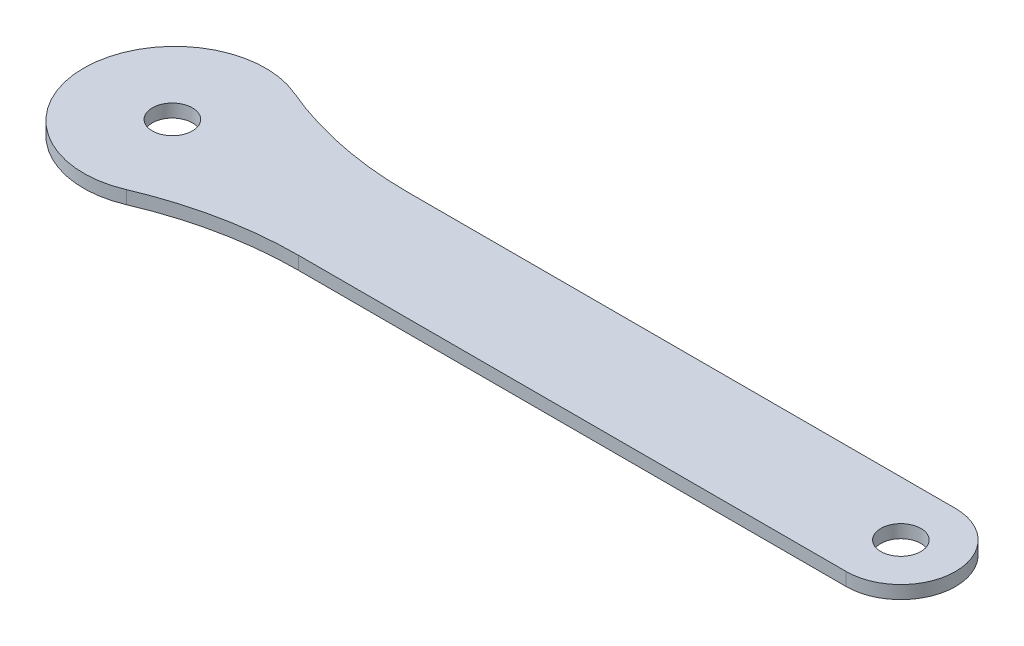
ISO-10303-21;
HEADER;
FILE_DESCRIPTION(('STEP AP214'),'2;1');
FILE_NAME('part.step','',(''),(''),'','','');
FILE_SCHEMA(('AUTOMOTIVE_DESIGN { 1 0 10303 214 1 1 1 1 }'));
ENDSEC;
DATA;
#1=APPLICATION_CONTEXT('core data for automotive mechanical design processes');
#2=APPLICATION_PROTOCOL_DEFINITION('international standard','automotive_design',2000,#1);
#3=PRODUCT_CONTEXT('',#1,'mechanical');
#4=PRODUCT('Part','Part','',(#3));
#5=PRODUCT_RELATED_PRODUCT_CATEGORY('part','',(#4));
#6=PRODUCT_DEFINITION_FORMATION('','',#4);
#7=PRODUCT_DEFINITION_CONTEXT('part definition',#1,'design');
#8=PRODUCT_DEFINITION('design','',#6,#7);
#9=PRODUCT_DEFINITION_SHAPE('','',#8);
#10=(LENGTH_UNIT() NAMED_UNIT(*) SI_UNIT(.MILLI.,.METRE.));
#11=(NAMED_UNIT(*) PLANE_ANGLE_UNIT() SI_UNIT($,.RADIAN.));
#12=(NAMED_UNIT(*) SI_UNIT($,.STERADIAN.) SOLID_ANGLE_UNIT());
#13=UNCERTAINTY_MEASURE_WITH_UNIT(LENGTH_MEASURE(1.E-05),#10,'distance_accuracy_value','');
#14=(GEOMETRIC_REPRESENTATION_CONTEXT(3) GLOBAL_UNCERTAINTY_ASSIGNED_CONTEXT((#13)) GLOBAL_UNIT_ASSIGNED_CONTEXT((#10,
#11,#12)) REPRESENTATION_CONTEXT('',''));
#15=CARTESIAN_POINT('',(0.,0.,0.));
#16=DIRECTION('',(0.,0.,1.));
#17=DIRECTION('',(1.,0.,0.));
#18=AXIS2_PLACEMENT_3D('',#15,#16,#17);
#19=CARTESIAN_POINT('',(0.,0.,0.));
#20=DIRECTION('',(0.,1.,0.));
#21=DIRECTION('',(0.,0.,1.));
#22=AXIS2_PLACEMENT_3D('',#19,#20,#21);
#23=PLANE('',#22);
#24=CARTESIAN_POINT('',(0.,0.,0.));
#25=DIRECTION('',(0.,1.,0.));
#26=DIRECTION('',(0.,0.,1.));
#27=AXIS2_PLACEMENT_3D('',#24,#25,#26);
#28=CIRCLE('',#27,1.397);
#29=CARTESIAN_POINT('',(0.,0.,1.397));
#30=VERTEX_POINT('',#29);
#31=EDGE_CURVE('E107',#30,#30,#28,.T.);
#32=ORIENTED_EDGE('',*,*,#31,.T.);
#33=EDGE_LOOP('',(#32));
#34=FACE_BOUND('',#33,.T.);
#35=CARTESIAN_POINT('',(-50.8,0.,0.));
#36=DIRECTION('',(0.,1.,0.));
#37=DIRECTION('',(0.,0.,1.));
#38=AXIS2_PLACEMENT_3D('',#35,#36,#37);
#39=CIRCLE('',#38,1.397);
#40=CARTESIAN_POINT('',(-50.8,0.,1.397));
#41=VERTEX_POINT('',#40);
#42=EDGE_CURVE('E110',#41,#41,#39,.T.);
#43=ORIENTED_EDGE('',*,*,#42,.T.);
#44=EDGE_LOOP('',(#43));
#45=FACE_BOUND('',#44,.T.);
#46=DIRECTION('',(-1.,0.,0.));
#47=VECTOR('',#46,1.);
#48=CARTESIAN_POINT('',(0.,0.,-3.81));
#49=LINE('',#48,#47);
#50=CARTESIAN_POINT('',(0.,0.,-3.81));
#51=VERTEX_POINT('',#50);
#52=CARTESIAN_POINT('',(-38.197067150875,0.,-3.81));
#53=VERTEX_POINT('',#52);
#54=EDGE_CURVE('E71',#51,#53,#49,.T.);
#55=ORIENTED_EDGE('',*,*,#54,.F.);
#56=CARTESIAN_POINT('',(0.,0.,0.));
#57=DIRECTION('',(0.,1.,0.));
#58=DIRECTION('',(0.,0.,1.));
#59=AXIS2_PLACEMENT_3D('',#56,#57,#58);
#60=CIRCLE('',#59,3.81);
#61=CARTESIAN_POINT('',(0.,0.,3.81));
#62=VERTEX_POINT('',#61);
#63=EDGE_CURVE('E19',#62,#51,#60,.T.);
#64=ORIENTED_EDGE('',*,*,#63,.F.);
#65=DIRECTION('',(1.,0.,0.));
#66=VECTOR('',#65,1.);
#67=CARTESIAN_POINT('',(-44.4187710975443,0.,3.81));
#68=LINE('',#67,#66);
#69=CARTESIAN_POINT('',(-38.197067150875,0.,3.81));
#70=VERTEX_POINT('',#69);
#71=EDGE_CURVE('E69',#70,#62,#68,.T.);
#72=ORIENTED_EDGE('',*,*,#71,.F.);
#73=CARTESIAN_POINT('',(-38.197067150875,0.,29.21));
#74=DIRECTION('',(0.,1.,0.));
#75=DIRECTION('',(0.,0.,1.));
#76=AXIS2_PLACEMENT_3D('',#73,#74,#75);
#77=CIRCLE('',#76,25.4);
#78=CARTESIAN_POINT('',(-48.1517934655459,0.,5.842));
#79=VERTEX_POINT('',#78);
#80=EDGE_CURVE('E86',#70,#79,#77,.T.);
#81=ORIENTED_EDGE('',*,*,#80,.T.);
#82=CARTESIAN_POINT('',(-50.6404750442136,0.,0.));
#83=DIRECTION('',(0.,1.,0.));
#84=DIRECTION('',(0.,0.,1.));
#85=AXIS2_PLACEMENT_3D('',#82,#83,#84);
#86=CIRCLE('',#85,6.35);
#87=CARTESIAN_POINT('',(-48.1517934655459,0.,-5.842));
#88=VERTEX_POINT('',#87);
#89=EDGE_CURVE('E114',#88,#79,#86,.T.);
#90=ORIENTED_EDGE('',*,*,#89,.F.);
#91=CARTESIAN_POINT('',(-38.197067150875,0.,-29.21));
#92=DIRECTION('',(0.,-1.,0.));
#93=DIRECTION('',(0.,0.,-1.));
#94=AXIS2_PLACEMENT_3D('',#91,#92,#93);
#95=CIRCLE('',#94,25.4);
#96=EDGE_CURVE('E117',#88,#53,#95,.F.);
#97=ORIENTED_EDGE('',*,*,#96,.T.);
#98=EDGE_LOOP('',(#55,#64,#72,#81,#90,#97));
#99=FACE_BOUND('',#98,.T.);
#100=ADVANCED_FACE('F16',(#34,#45,#99),#23,.F.);
#101=CARTESIAN_POINT('',(0.,0.,0.));
#102=DIRECTION('',(0.,1.,0.));
#103=DIRECTION('',(0.,0.,1.));
#104=AXIS2_PLACEMENT_3D('',#101,#102,#103);
#105=CYLINDRICAL_SURFACE('',#104,3.81);
#106=DIRECTION('',(0.,1.,0.));
#107=VECTOR('',#106,1.);
#108=CARTESIAN_POINT('',(0.,0.,3.81));
#109=LINE('',#108,#107);
#110=CARTESIAN_POINT('',(0.,0.91186,3.81));
#111=VERTEX_POINT('',#110);
#112=EDGE_CURVE('E76',#62,#111,#109,.T.);
#113=ORIENTED_EDGE('',*,*,#112,.F.);
#114=ORIENTED_EDGE('',*,*,#63,.T.);
#115=DIRECTION('',(0.,1.,0.));
#116=VECTOR('',#115,1.);
#117=CARTESIAN_POINT('',(0.,0.,-3.81));
#118=LINE('',#117,#116);
#119=CARTESIAN_POINT('',(0.,0.91186,-3.81));
#120=VERTEX_POINT('',#119);
#121=EDGE_CURVE('E74',#120,#51,#118,.F.);
#122=ORIENTED_EDGE('',*,*,#121,.F.);
#123=CARTESIAN_POINT('',(0.,0.91186,0.));
#124=DIRECTION('',(0.,1.,0.));
#125=DIRECTION('',(0.,0.,1.));
#126=AXIS2_PLACEMENT_3D('',#123,#124,#125);
#127=CIRCLE('',#126,3.81);
#128=EDGE_CURVE('E79',#111,#120,#127,.T.);
#129=ORIENTED_EDGE('',*,*,#128,.F.);
#130=EDGE_LOOP('',(#113,#114,#122,#129));
#131=FACE_BOUND('',#130,.T.);
#132=ADVANCED_FACE('F77',(#131),#105,.T.);
#133=CARTESIAN_POINT('',(0.,0.,-3.81));
#134=DIRECTION('',(0.,0.,-1.));
#135=DIRECTION('',(-1.,0.,0.));
#136=AXIS2_PLACEMENT_3D('',#133,#134,#135);
#137=PLANE('',#136);
#138=ORIENTED_EDGE('',*,*,#54,.T.);
#139=DIRECTION('',(0.,-1.,0.));
#140=VECTOR('',#139,1.);
#141=CARTESIAN_POINT('',(-38.197067150875,31.545100232,-3.81));
#142=LINE('',#141,#140);
#143=CARTESIAN_POINT('',(-38.197067150875,0.91186,-3.81));
#144=VERTEX_POINT('',#143);
#145=EDGE_CURVE('E91',#53,#144,#142,.F.);
#146=ORIENTED_EDGE('',*,*,#145,.T.);
#147=DIRECTION('',(1.,0.,0.));
#148=VECTOR('',#147,1.);
#149=CARTESIAN_POINT('',(0.,0.91186,-3.81));
#150=LINE('',#149,#148);
#151=EDGE_CURVE('E105',#120,#144,#150,.F.);
#152=ORIENTED_EDGE('',*,*,#151,.F.);
#153=ORIENTED_EDGE('',*,*,#121,.T.);
#154=EDGE_LOOP('',(#138,#146,#152,#153));
#155=FACE_BOUND('',#154,.T.);
#156=ADVANCED_FACE('F138',(#155),#137,.T.);
#157=CARTESIAN_POINT('',(-38.197067150875,31.545100232,-29.21));
#158=DIRECTION('',(0.,-1.,0.));
#159=DIRECTION('',(0.,0.,-1.));
#160=AXIS2_PLACEMENT_3D('',#157,#158,#159);
#161=CYLINDRICAL_SURFACE('',#160,25.4);
#162=DIRECTION('',(0.,1.,0.));
#163=VECTOR('',#162,1.);
#164=CARTESIAN_POINT('',(-48.1517934655459,0.,-5.842));
#165=LINE('',#164,#163);
#166=CARTESIAN_POINT('',(-48.1517934655459,0.91186,-5.842));
#167=VERTEX_POINT('',#166);
#168=EDGE_CURVE('E116',#167,#88,#165,.F.);
#169=ORIENTED_EDGE('',*,*,#168,.F.);
#170=CARTESIAN_POINT('',(-38.197067150875,0.91186,-29.21));
#171=DIRECTION('',(0.,-1.,0.));
#172=DIRECTION('',(0.,0.,-1.));
#173=AXIS2_PLACEMENT_3D('',#170,#171,#172);
#174=CIRCLE('',#173,25.4);
#175=EDGE_CURVE('E102',#144,#167,#174,.T.);
#176=ORIENTED_EDGE('',*,*,#175,.F.);
#177=ORIENTED_EDGE('',*,*,#145,.F.);
#178=ORIENTED_EDGE('',*,*,#96,.F.);
#179=EDGE_LOOP('',(#169,#176,#177,#178));
#180=FACE_BOUND('',#179,.T.);
#181=ADVANCED_FACE('F137',(#180),#161,.F.);
#182=CARTESIAN_POINT('',(-50.6404750442136,0.,0.));
#183=DIRECTION('',(0.,1.,0.));
#184=DIRECTION('',(0.,0.,1.));
#185=AXIS2_PLACEMENT_3D('',#182,#183,#184);
#186=CYLINDRICAL_SURFACE('',#185,6.35);
#187=ORIENTED_EDGE('',*,*,#89,.T.);
#188=DIRECTION('',(0.,1.,0.));
#189=VECTOR('',#188,1.);
#190=CARTESIAN_POINT('',(-48.1517934655458,-30.633240232,5.84199999999999));
#191=LINE('',#190,#189);
#192=CARTESIAN_POINT('',(-48.1517934655459,0.91186,5.842));
#193=VERTEX_POINT('',#192);
#194=EDGE_CURVE('E84',#79,#193,#191,.T.);
#195=ORIENTED_EDGE('',*,*,#194,.T.);
#196=CARTESIAN_POINT('',(-50.6404750442136,0.91186,0.));
#197=DIRECTION('',(0.,1.,0.));
#198=DIRECTION('',(0.,0.,1.));
#199=AXIS2_PLACEMENT_3D('',#196,#197,#198);
#200=CIRCLE('',#199,6.35);
#201=EDGE_CURVE('E99',#167,#193,#200,.T.);
#202=ORIENTED_EDGE('',*,*,#201,.F.);
#203=ORIENTED_EDGE('',*,*,#168,.T.);
#204=EDGE_LOOP('',(#187,#195,#202,#203));
#205=FACE_BOUND('',#204,.T.);
#206=ADVANCED_FACE('F135',(#205),#186,.T.);
#207=CARTESIAN_POINT('',(-38.197067150875,-30.633240232,29.21));
#208=DIRECTION('',(0.,1.,0.));
#209=DIRECTION('',(0.,0.,1.));
#210=AXIS2_PLACEMENT_3D('',#207,#208,#209);
#211=CYLINDRICAL_SURFACE('',#210,25.4);
#212=ORIENTED_EDGE('',*,*,#194,.F.);
#213=ORIENTED_EDGE('',*,*,#80,.F.);
#214=DIRECTION('',(0.,1.,0.));
#215=VECTOR('',#214,1.);
#216=CARTESIAN_POINT('',(-38.197067150875,0.,3.81));
#217=LINE('',#216,#215);
#218=CARTESIAN_POINT('',(-38.197067150875,0.91186,3.81));
#219=VERTEX_POINT('',#218);
#220=EDGE_CURVE('E34',#219,#70,#217,.F.);
#221=ORIENTED_EDGE('',*,*,#220,.F.);
#222=CARTESIAN_POINT('',(-38.197067150875,0.91186,29.21));
#223=DIRECTION('',(0.,1.,0.));
#224=DIRECTION('',(0.,0.,1.));
#225=AXIS2_PLACEMENT_3D('',#222,#223,#224);
#226=CIRCLE('',#225,25.4);
#227=EDGE_CURVE('E96',#193,#219,#226,.F.);
#228=ORIENTED_EDGE('',*,*,#227,.F.);
#229=EDGE_LOOP('',(#212,#213,#221,#228));
#230=FACE_BOUND('',#229,.T.);
#231=ADVANCED_FACE('F133',(#230),#211,.F.);
#232=CARTESIAN_POINT('',(-44.4187710975443,0.,3.81));
#233=DIRECTION('',(0.,0.,1.));
#234=DIRECTION('',(1.,0.,0.));
#235=AXIS2_PLACEMENT_3D('',#232,#233,#234);
#236=PLANE('',#235);
#237=DIRECTION('',(1.,0.,0.));
#238=VECTOR('',#237,1.);
#239=CARTESIAN_POINT('',(0.,0.91186,3.81));
#240=LINE('',#239,#238);
#241=EDGE_CURVE('E95',#219,#111,#240,.T.);
#242=ORIENTED_EDGE('',*,*,#241,.F.);
#243=ORIENTED_EDGE('',*,*,#220,.T.);
#244=ORIENTED_EDGE('',*,*,#71,.T.);
#245=ORIENTED_EDGE('',*,*,#112,.T.);
#246=EDGE_LOOP('',(#242,#243,#244,#245));
#247=FACE_BOUND('',#246,.T.);
#248=ADVANCED_FACE('F83',(#247),#236,.T.);
#249=CARTESIAN_POINT('',(-50.8,0.,0.));
#250=DIRECTION('',(0.,1.,0.));
#251=DIRECTION('',(0.,0.,1.));
#252=AXIS2_PLACEMENT_3D('',#249,#250,#251);
#253=CYLINDRICAL_SURFACE('',#252,1.397);
#254=CARTESIAN_POINT('',(-50.8,0.91186,0.));
#255=DIRECTION('',(0.,1.,0.));
#256=DIRECTION('',(0.,0.,1.));
#257=AXIS2_PLACEMENT_3D('',#254,#255,#256);
#258=CIRCLE('',#257,1.397);
#259=CARTESIAN_POINT('',(-50.8,0.91186,1.397));
#260=VERTEX_POINT('',#259);
#261=EDGE_CURVE('E25',#260,#260,#258,.F.);
#262=ORIENTED_EDGE('',*,*,#261,.F.);
#263=EDGE_LOOP('',(#262));
#264=FACE_BOUND('',#263,.T.);
#265=ORIENTED_EDGE('',*,*,#42,.F.);
#266=EDGE_LOOP('',(#265));
#267=FACE_BOUND('',#266,.T.);
#268=ADVANCED_FACE('F154',(#264,#267),#253,.F.);
#269=CARTESIAN_POINT('',(0.,0.,0.));
#270=DIRECTION('',(0.,1.,0.));
#271=DIRECTION('',(0.,0.,1.));
#272=AXIS2_PLACEMENT_3D('',#269,#270,#271);
#273=CYLINDRICAL_SURFACE('',#272,1.397);
#274=CARTESIAN_POINT('',(0.,0.91186,0.));
#275=DIRECTION('',(0.,1.,0.));
#276=DIRECTION('',(0.,0.,1.));
#277=AXIS2_PLACEMENT_3D('',#274,#275,#276);
#278=CIRCLE('',#277,1.397);
#279=CARTESIAN_POINT('',(0.,0.91186,1.397));
#280=VERTEX_POINT('',#279);
#281=EDGE_CURVE('E11',#280,#280,#278,.F.);
#282=ORIENTED_EDGE('',*,*,#281,.F.);
#283=EDGE_LOOP('',(#282));
#284=FACE_BOUND('',#283,.T.);
#285=ORIENTED_EDGE('',*,*,#31,.F.);
#286=EDGE_LOOP('',(#285));
#287=FACE_BOUND('',#286,.T.);
#288=ADVANCED_FACE('F148',(#284,#287),#273,.F.);
#289=CARTESIAN_POINT('',(0.,0.91186,0.));
#290=DIRECTION('',(0.,1.,0.));
#291=DIRECTION('',(0.,0.,1.));
#292=AXIS2_PLACEMENT_3D('',#289,#290,#291);
#293=PLANE('',#292);
#294=ORIENTED_EDGE('',*,*,#281,.T.);
#295=EDGE_LOOP('',(#294));
#296=FACE_BOUND('',#295,.T.);
#297=ORIENTED_EDGE('',*,*,#261,.T.);
#298=EDGE_LOOP('',(#297));
#299=FACE_BOUND('',#298,.T.);
#300=ORIENTED_EDGE('',*,*,#227,.T.);
#301=ORIENTED_EDGE('',*,*,#241,.T.);
#302=ORIENTED_EDGE('',*,*,#128,.T.);
#303=ORIENTED_EDGE('',*,*,#151,.T.);
#304=ORIENTED_EDGE('',*,*,#175,.T.);
#305=ORIENTED_EDGE('',*,*,#201,.T.);
#306=EDGE_LOOP('',(#300,#301,#302,#303,#304,#305));
#307=FACE_BOUND('',#306,.T.);
#308=ADVANCED_FACE('F130',(#296,#299,#307),#293,.T.);
#309=CLOSED_SHELL('',(#100,#132,#156,#181,#206,#231,#248,#268,#288,#308));
#310=MANIFOLD_SOLID_BREP('B1',#309);
#311=ADVANCED_BREP_SHAPE_REPRESENTATION('',(#18,#310),#14);
#312=SHAPE_DEFINITION_REPRESENTATION(#9,#311);
ENDSEC;
END-ISO-10303-21;
